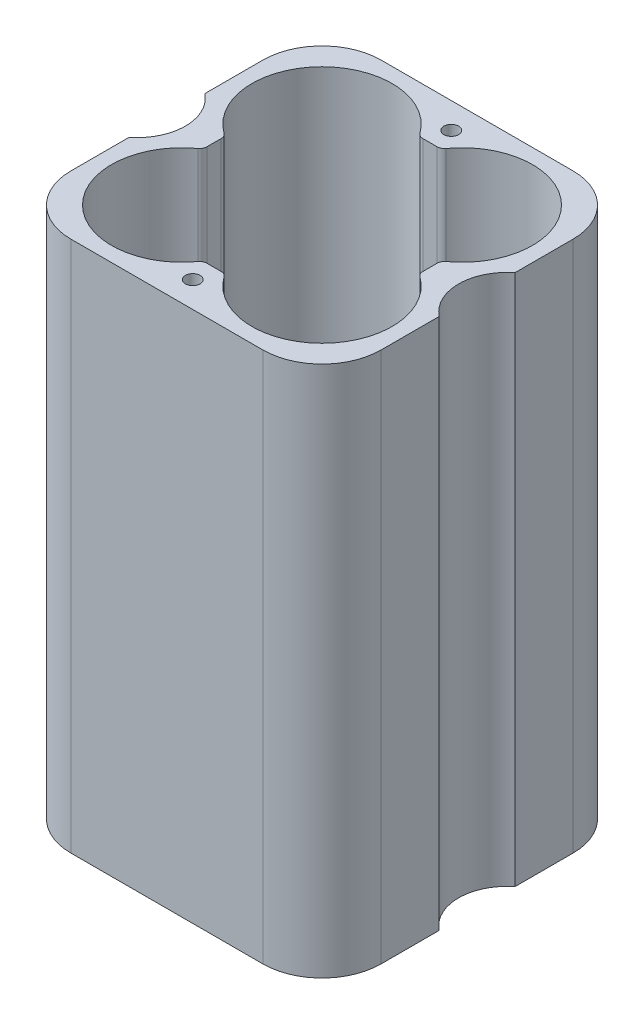
ISO-10303-21;
HEADER;
FILE_DESCRIPTION(('STEP AP214'),'2;1');
FILE_NAME('part.step','',(''),(''),'','','');
FILE_SCHEMA(('AUTOMOTIVE_DESIGN { 1 0 10303 214 1 1 1 1 }'));
ENDSEC;
DATA;
#1=APPLICATION_CONTEXT('core data for automotive mechanical design processes');
#2=APPLICATION_PROTOCOL_DEFINITION('international standard','automotive_design',2000,#1);
#3=PRODUCT_CONTEXT('',#1,'mechanical');
#4=PRODUCT('Part','Part','',(#3));
#5=PRODUCT_RELATED_PRODUCT_CATEGORY('part','',(#4));
#6=PRODUCT_DEFINITION_FORMATION('','',#4);
#7=PRODUCT_DEFINITION_CONTEXT('part definition',#1,'design');
#8=PRODUCT_DEFINITION('design','',#6,#7);
#9=PRODUCT_DEFINITION_SHAPE('','',#8);
#10=(LENGTH_UNIT() NAMED_UNIT(*) SI_UNIT(.MILLI.,.METRE.));
#11=(NAMED_UNIT(*) PLANE_ANGLE_UNIT() SI_UNIT($,.RADIAN.));
#12=(NAMED_UNIT(*) SI_UNIT($,.STERADIAN.) SOLID_ANGLE_UNIT());
#13=UNCERTAINTY_MEASURE_WITH_UNIT(LENGTH_MEASURE(1.E-05),#10,'distance_accuracy_value','');
#14=(GEOMETRIC_REPRESENTATION_CONTEXT(3) GLOBAL_UNCERTAINTY_ASSIGNED_CONTEXT((#13)) GLOBAL_UNIT_ASSIGNED_CONTEXT((#10,
#11,#12)) REPRESENTATION_CONTEXT('',''));
#15=CARTESIAN_POINT('',(0.,0.,0.));
#16=DIRECTION('',(0.,0.,1.));
#17=DIRECTION('',(1.,0.,0.));
#18=AXIS2_PLACEMENT_3D('',#15,#16,#17);
#19=CARTESIAN_POINT('',(21.,70.,0.));
#20=DIRECTION('',(-1.,0.,0.));
#21=DIRECTION('',(0.,0.,1.));
#22=AXIS2_PLACEMENT_3D('',#19,#20,#21);
#23=PLANE('',#22);
#24=DIRECTION('',(0.,-1.,0.));
#25=VECTOR('',#24,1.);
#26=CARTESIAN_POINT('',(21.,70.,12.9999999999999));
#27=LINE('',#26,#25);
#28=CARTESIAN_POINT('',(21.,70.,12.9999999999999));
#29=VERTEX_POINT('',#28);
#30=CARTESIAN_POINT('',(21.,-2.,12.9999999999999));
#31=VERTEX_POINT('',#30);
#32=EDGE_CURVE('E236',#29,#31,#27,.T.);
#33=ORIENTED_EDGE('',*,*,#32,.T.);
#34=DIRECTION('',(0.,0.,1.));
#35=VECTOR('',#34,1.);
#36=CARTESIAN_POINT('',(21.,-2.,5.12347538297982));
#37=LINE('',#36,#35);
#38=CARTESIAN_POINT('',(21.,-2.,5.12347538297982));
#39=VERTEX_POINT('',#38);
#40=EDGE_CURVE('E235',#39,#31,#37,.T.);
#41=ORIENTED_EDGE('',*,*,#40,.F.);
#42=DIRECTION('',(0.,-1.,0.));
#43=VECTOR('',#42,1.);
#44=CARTESIAN_POINT('',(21.,70.,5.12347538297982));
#45=LINE('',#44,#43);
#46=CARTESIAN_POINT('',(21.,70.,5.12347538297982));
#47=VERTEX_POINT('',#46);
#48=EDGE_CURVE('E221',#47,#39,#45,.T.);
#49=ORIENTED_EDGE('',*,*,#48,.F.);
#50=DIRECTION('',(0.,0.,-1.));
#51=VECTOR('',#50,1.);
#52=CARTESIAN_POINT('',(21.,70.,0.));
#53=LINE('',#52,#51);
#54=EDGE_CURVE('E306',#29,#47,#53,.T.);
#55=ORIENTED_EDGE('',*,*,#54,.F.);
#56=EDGE_LOOP('',(#33,#41,#49,#55));
#57=FACE_BOUND('',#56,.T.);
#58=ADVANCED_FACE('F36',(#57),#23,.F.);
#59=CARTESIAN_POINT('',(25.,70.,0.));
#60=DIRECTION('',(0.,-1.,0.));
#61=DIRECTION('',(0.,0.,-1.));
#62=AXIS2_PLACEMENT_3D('',#59,#60,#61);
#63=CYLINDRICAL_SURFACE('',#62,6.50000000000002);
#64=ORIENTED_EDGE('',*,*,#48,.T.);
#65=CARTESIAN_POINT('',(25.,-2.,0.));
#66=DIRECTION('',(0.,1.,0.));
#67=DIRECTION('',(0.,0.,-1.));
#68=AXIS2_PLACEMENT_3D('',#65,#66,#67);
#69=CIRCLE('',#68,6.50000000000002);
#70=CARTESIAN_POINT('',(21.,-2.,-5.12347538297982));
#71=VERTEX_POINT('',#70);
#72=EDGE_CURVE('E226',#71,#39,#69,.T.);
#73=ORIENTED_EDGE('',*,*,#72,.F.);
#74=DIRECTION('',(0.,-1.,0.));
#75=VECTOR('',#74,1.);
#76=CARTESIAN_POINT('',(21.,70.,-5.12347538297982));
#77=LINE('',#76,#75);
#78=CARTESIAN_POINT('',(21.,70.,-5.12347538297982));
#79=VERTEX_POINT('',#78);
#80=EDGE_CURVE('E232',#79,#71,#77,.T.);
#81=ORIENTED_EDGE('',*,*,#80,.F.);
#82=CARTESIAN_POINT('',(25.,70.,0.));
#83=DIRECTION('',(0.,1.,0.));
#84=DIRECTION('',(0.,0.,1.));
#85=AXIS2_PLACEMENT_3D('',#82,#83,#84);
#86=CIRCLE('',#85,6.50000000000002);
#87=EDGE_CURVE('E227',#47,#79,#86,.F.);
#88=ORIENTED_EDGE('',*,*,#87,.F.);
#89=EDGE_LOOP('',(#64,#73,#81,#88));
#90=FACE_BOUND('',#89,.T.);
#91=ADVANCED_FACE('F223',(#90),#63,.F.);
#92=ORIENTED_EDGE('',*,*,#80,.T.);
#93=DIRECTION('',(0.,0.,1.));
#94=VECTOR('',#93,1.);
#95=CARTESIAN_POINT('',(21.,-2.,-13.));
#96=LINE('',#95,#94);
#97=CARTESIAN_POINT('',(21.,-2.,-13.));
#98=VERTEX_POINT('',#97);
#99=EDGE_CURVE('E246',#98,#71,#96,.T.);
#100=ORIENTED_EDGE('',*,*,#99,.F.);
#101=DIRECTION('',(0.,-1.,0.));
#102=VECTOR('',#101,1.);
#103=CARTESIAN_POINT('',(21.,70.,-12.9999999999999));
#104=LINE('',#103,#102);
#105=CARTESIAN_POINT('',(21.,70.,-12.9999999999999));
#106=VERTEX_POINT('',#105);
#107=EDGE_CURVE('E371',#106,#98,#104,.T.);
#108=ORIENTED_EDGE('',*,*,#107,.F.);
#109=EDGE_CURVE('E308',#79,#106,#53,.T.);
#110=ORIENTED_EDGE('',*,*,#109,.F.);
#111=EDGE_LOOP('',(#92,#100,#108,#110));
#112=FACE_BOUND('',#111,.T.);
#113=ADVANCED_FACE('F516',(#112),#23,.F.);
#114=CARTESIAN_POINT('',(13.,70.,-13.));
#115=DIRECTION('',(0.,-1.,0.));
#116=DIRECTION('',(0.,0.,-1.));
#117=AXIS2_PLACEMENT_3D('',#114,#115,#116);
#118=CYLINDRICAL_SURFACE('',#117,8.);
#119=ORIENTED_EDGE('',*,*,#107,.T.);
#120=CARTESIAN_POINT('',(13.,-2.,-13.));
#121=DIRECTION('',(0.,-1.,0.));
#122=DIRECTION('',(0.,0.,-1.));
#123=AXIS2_PLACEMENT_3D('',#120,#121,#122);
#124=CIRCLE('',#123,8.);
#125=CARTESIAN_POINT('',(12.9999999999999,-2.,-21.));
#126=VERTEX_POINT('',#125);
#127=EDGE_CURVE('E278',#126,#98,#124,.T.);
#128=ORIENTED_EDGE('',*,*,#127,.F.);
#129=DIRECTION('',(0.,-1.,0.));
#130=VECTOR('',#129,1.);
#131=CARTESIAN_POINT('',(12.9999999999999,70.,-21.));
#132=LINE('',#131,#130);
#133=CARTESIAN_POINT('',(12.9999999999999,70.,-21.));
#134=VERTEX_POINT('',#133);
#135=EDGE_CURVE('E369',#134,#126,#132,.T.);
#136=ORIENTED_EDGE('',*,*,#135,.F.);
#137=CARTESIAN_POINT('',(13.,70.,-13.));
#138=DIRECTION('',(0.,1.,0.));
#139=DIRECTION('',(0.,0.,1.));
#140=AXIS2_PLACEMENT_3D('',#137,#138,#139);
#141=CIRCLE('',#140,8.);
#142=EDGE_CURVE('E310',#106,#134,#141,.T.);
#143=ORIENTED_EDGE('',*,*,#142,.F.);
#144=EDGE_LOOP('',(#119,#128,#136,#143));
#145=FACE_BOUND('',#144,.T.);
#146=ADVANCED_FACE('F523',(#145),#118,.T.);
#147=CARTESIAN_POINT('',(0.,70.,-21.));
#148=DIRECTION('',(0.,0.,-1.));
#149=DIRECTION('',(-1.,0.,0.));
#150=AXIS2_PLACEMENT_3D('',#147,#148,#149);
#151=PLANE('',#150);
#152=ORIENTED_EDGE('',*,*,#135,.T.);
#153=DIRECTION('',(1.,0.,0.));
#154=VECTOR('',#153,1.);
#155=CARTESIAN_POINT('',(-12.9999999999999,-2.,-21.));
#156=LINE('',#155,#154);
#157=CARTESIAN_POINT('',(-13.,-2.,-21.));
#158=VERTEX_POINT('',#157);
#159=EDGE_CURVE('E275',#158,#126,#156,.T.);
#160=ORIENTED_EDGE('',*,*,#159,.F.);
#161=DIRECTION('',(0.,-1.,0.));
#162=VECTOR('',#161,1.);
#163=CARTESIAN_POINT('',(-12.9999999999999,70.,-21.));
#164=LINE('',#163,#162);
#165=CARTESIAN_POINT('',(-12.9999999999999,70.,-21.));
#166=VERTEX_POINT('',#165);
#167=EDGE_CURVE('E367',#166,#158,#164,.T.);
#168=ORIENTED_EDGE('',*,*,#167,.F.);
#169=DIRECTION('',(1.,0.,0.));
#170=VECTOR('',#169,1.);
#171=CARTESIAN_POINT('',(0.,70.,-21.));
#172=LINE('',#171,#170);
#173=EDGE_CURVE('E312',#166,#134,#172,.T.);
#174=ORIENTED_EDGE('',*,*,#173,.T.);
#175=EDGE_LOOP('',(#152,#160,#168,#174));
#176=FACE_BOUND('',#175,.T.);
#177=ADVANCED_FACE('F528',(#176),#151,.T.);
#178=CARTESIAN_POINT('',(-13.,70.,-13.));
#179=DIRECTION('',(0.,-1.,0.));
#180=DIRECTION('',(0.,0.,-1.));
#181=AXIS2_PLACEMENT_3D('',#178,#179,#180);
#182=CYLINDRICAL_SURFACE('',#181,8.);
#183=ORIENTED_EDGE('',*,*,#167,.T.);
#184=CARTESIAN_POINT('',(-13.,-2.,-13.));
#185=DIRECTION('',(0.,-1.,0.));
#186=DIRECTION('',(0.,0.,-1.));
#187=AXIS2_PLACEMENT_3D('',#184,#185,#186);
#188=CIRCLE('',#187,8.);
#189=CARTESIAN_POINT('',(-21.,-2.,-12.9999999999999));
#190=VERTEX_POINT('',#189);
#191=EDGE_CURVE('E272',#190,#158,#188,.T.);
#192=ORIENTED_EDGE('',*,*,#191,.F.);
#193=DIRECTION('',(0.,-1.,0.));
#194=VECTOR('',#193,1.);
#195=CARTESIAN_POINT('',(-21.,70.,-12.9999999999999));
#196=LINE('',#195,#194);
#197=CARTESIAN_POINT('',(-21.,70.,-12.9999999999999));
#198=VERTEX_POINT('',#197);
#199=EDGE_CURVE('E365',#198,#190,#196,.T.);
#200=ORIENTED_EDGE('',*,*,#199,.F.);
#201=CARTESIAN_POINT('',(-13.,70.,-13.));
#202=DIRECTION('',(0.,1.,0.));
#203=DIRECTION('',(0.,0.,1.));
#204=AXIS2_PLACEMENT_3D('',#201,#202,#203);
#205=CIRCLE('',#204,8.);
#206=EDGE_CURVE('E315',#198,#166,#205,.F.);
#207=ORIENTED_EDGE('',*,*,#206,.T.);
#208=EDGE_LOOP('',(#183,#192,#200,#207));
#209=FACE_BOUND('',#208,.T.);
#210=ADVANCED_FACE('F565',(#209),#182,.T.);
#211=CARTESIAN_POINT('',(-21.,70.,0.));
#212=DIRECTION('',(-1.,0.,0.));
#213=DIRECTION('',(0.,0.,1.));
#214=AXIS2_PLACEMENT_3D('',#211,#212,#213);
#215=PLANE('',#214);
#216=ORIENTED_EDGE('',*,*,#199,.T.);
#217=DIRECTION('',(0.,0.,-1.));
#218=VECTOR('',#217,1.);
#219=CARTESIAN_POINT('',(-21.,-2.,-5.12347538297981));
#220=LINE('',#219,#218);
#221=CARTESIAN_POINT('',(-21.,-2.,-5.12347538297981));
#222=VERTEX_POINT('',#221);
#223=EDGE_CURVE('E269',#222,#190,#220,.T.);
#224=ORIENTED_EDGE('',*,*,#223,.F.);
#225=DIRECTION('',(0.,-1.,0.));
#226=VECTOR('',#225,1.);
#227=CARTESIAN_POINT('',(-21.,70.,-5.12347538297981));
#228=LINE('',#227,#226);
#229=CARTESIAN_POINT('',(-21.,70.,-5.12347538297981));
#230=VERTEX_POINT('',#229);
#231=EDGE_CURVE('E363',#230,#222,#228,.T.);
#232=ORIENTED_EDGE('',*,*,#231,.F.);
#233=DIRECTION('',(0.,0.,-1.));
#234=VECTOR('',#233,1.);
#235=CARTESIAN_POINT('',(-21.,70.,0.));
#236=LINE('',#235,#234);
#237=EDGE_CURVE('E318',#230,#198,#236,.T.);
#238=ORIENTED_EDGE('',*,*,#237,.T.);
#239=EDGE_LOOP('',(#216,#224,#232,#238));
#240=FACE_BOUND('',#239,.T.);
#241=ADVANCED_FACE('F560',(#240),#215,.T.);
#242=CARTESIAN_POINT('',(-25.,70.,0.));
#243=DIRECTION('',(0.,-1.,0.));
#244=DIRECTION('',(0.,0.,-1.));
#245=AXIS2_PLACEMENT_3D('',#242,#243,#244);
#246=CYLINDRICAL_SURFACE('',#245,6.50000000000001);
#247=ORIENTED_EDGE('',*,*,#231,.T.);
#248=CARTESIAN_POINT('',(-25.,-2.,0.));
#249=DIRECTION('',(0.,1.,0.));
#250=DIRECTION('',(0.,0.,-1.));
#251=AXIS2_PLACEMENT_3D('',#248,#249,#250);
#252=CIRCLE('',#251,6.5);
#253=CARTESIAN_POINT('',(-21.,-2.,5.12347538297981));
#254=VERTEX_POINT('',#253);
#255=EDGE_CURVE('E266',#254,#222,#252,.T.);
#256=ORIENTED_EDGE('',*,*,#255,.F.);
#257=DIRECTION('',(0.,-1.,0.));
#258=VECTOR('',#257,1.);
#259=CARTESIAN_POINT('',(-21.,70.,5.12347538297981));
#260=LINE('',#259,#258);
#261=CARTESIAN_POINT('',(-21.,70.,5.12347538297981));
#262=VERTEX_POINT('',#261);
#263=EDGE_CURVE('E361',#262,#254,#260,.T.);
#264=ORIENTED_EDGE('',*,*,#263,.F.);
#265=CARTESIAN_POINT('',(-25.,70.,0.));
#266=DIRECTION('',(0.,1.,0.));
#267=DIRECTION('',(0.,0.,1.));
#268=AXIS2_PLACEMENT_3D('',#265,#266,#267);
#269=CIRCLE('',#268,6.50000000000001);
#270=EDGE_CURVE('E321',#262,#230,#269,.T.);
#271=ORIENTED_EDGE('',*,*,#270,.T.);
#272=EDGE_LOOP('',(#247,#256,#264,#271));
#273=FACE_BOUND('',#272,.T.);
#274=ADVANCED_FACE('F556',(#273),#246,.F.);
#275=ORIENTED_EDGE('',*,*,#263,.T.);
#276=DIRECTION('',(0.,0.,-1.));
#277=VECTOR('',#276,1.);
#278=CARTESIAN_POINT('',(-21.,-2.,12.9999999999999));
#279=LINE('',#278,#277);
#280=CARTESIAN_POINT('',(-21.,-2.,12.9999999999999));
#281=VERTEX_POINT('',#280);
#282=EDGE_CURVE('E263',#281,#254,#279,.T.);
#283=ORIENTED_EDGE('',*,*,#282,.F.);
#284=DIRECTION('',(0.,-1.,0.));
#285=VECTOR('',#284,1.);
#286=CARTESIAN_POINT('',(-21.,70.,12.9999999999999));
#287=LINE('',#286,#285);
#288=CARTESIAN_POINT('',(-21.,70.,12.9999999999999));
#289=VERTEX_POINT('',#288);
#290=EDGE_CURVE('E359',#289,#281,#287,.T.);
#291=ORIENTED_EDGE('',*,*,#290,.F.);
#292=EDGE_CURVE('E322',#289,#262,#236,.T.);
#293=ORIENTED_EDGE('',*,*,#292,.T.);
#294=EDGE_LOOP('',(#275,#283,#291,#293));
#295=FACE_BOUND('',#294,.T.);
#296=ADVANCED_FACE('F552',(#295),#215,.T.);
#297=CARTESIAN_POINT('',(-13.,70.,13.));
#298=DIRECTION('',(0.,-1.,0.));
#299=DIRECTION('',(0.,0.,-1.));
#300=AXIS2_PLACEMENT_3D('',#297,#298,#299);
#301=CYLINDRICAL_SURFACE('',#300,8.);
#302=ORIENTED_EDGE('',*,*,#290,.T.);
#303=CARTESIAN_POINT('',(-13.,-2.,13.));
#304=DIRECTION('',(0.,-1.,0.));
#305=DIRECTION('',(0.,0.,-1.));
#306=AXIS2_PLACEMENT_3D('',#303,#304,#305);
#307=CIRCLE('',#306,8.);
#308=CARTESIAN_POINT('',(-12.9999999999999,-2.,21.));
#309=VERTEX_POINT('',#308);
#310=EDGE_CURVE('E260',#309,#281,#307,.T.);
#311=ORIENTED_EDGE('',*,*,#310,.F.);
#312=DIRECTION('',(0.,-1.,0.));
#313=VECTOR('',#312,1.);
#314=CARTESIAN_POINT('',(-12.9999999999999,70.,21.));
#315=LINE('',#314,#313);
#316=CARTESIAN_POINT('',(-12.9999999999999,70.,21.));
#317=VERTEX_POINT('',#316);
#318=EDGE_CURVE('E357',#317,#309,#315,.T.);
#319=ORIENTED_EDGE('',*,*,#318,.F.);
#320=CARTESIAN_POINT('',(-13.,70.,13.));
#321=DIRECTION('',(0.,1.,0.));
#322=DIRECTION('',(0.,0.,1.));
#323=AXIS2_PLACEMENT_3D('',#320,#321,#322);
#324=CIRCLE('',#323,8.);
#325=EDGE_CURVE('E325',#289,#317,#324,.T.);
#326=ORIENTED_EDGE('',*,*,#325,.F.);
#327=EDGE_LOOP('',(#302,#311,#319,#326));
#328=FACE_BOUND('',#327,.T.);
#329=ADVANCED_FACE('F547',(#328),#301,.T.);
#330=CARTESIAN_POINT('',(0.,70.,21.));
#331=DIRECTION('',(0.,0.,-1.));
#332=DIRECTION('',(-1.,0.,0.));
#333=AXIS2_PLACEMENT_3D('',#330,#331,#332);
#334=PLANE('',#333);
#335=ORIENTED_EDGE('',*,*,#318,.T.);
#336=DIRECTION('',(-1.,0.,0.));
#337=VECTOR('',#336,1.);
#338=CARTESIAN_POINT('',(12.9999999999999,-2.,21.));
#339=LINE('',#338,#337);
#340=CARTESIAN_POINT('',(12.9999999999999,-2.,21.));
#341=VERTEX_POINT('',#340);
#342=EDGE_CURVE('E257',#341,#309,#339,.T.);
#343=ORIENTED_EDGE('',*,*,#342,.F.);
#344=DIRECTION('',(0.,-1.,0.));
#345=VECTOR('',#344,1.);
#346=CARTESIAN_POINT('',(12.9999999999999,70.,21.));
#347=LINE('',#346,#345);
#348=CARTESIAN_POINT('',(12.9999999999999,70.,21.));
#349=VERTEX_POINT('',#348);
#350=EDGE_CURVE('E355',#349,#341,#347,.T.);
#351=ORIENTED_EDGE('',*,*,#350,.F.);
#352=DIRECTION('',(1.,0.,0.));
#353=VECTOR('',#352,1.);
#354=CARTESIAN_POINT('',(0.,70.,21.));
#355=LINE('',#354,#353);
#356=EDGE_CURVE('E327',#317,#349,#355,.T.);
#357=ORIENTED_EDGE('',*,*,#356,.F.);
#358=EDGE_LOOP('',(#335,#343,#351,#357));
#359=FACE_BOUND('',#358,.T.);
#360=ADVANCED_FACE('F543',(#359),#334,.F.);
#361=CARTESIAN_POINT('',(9.5,70.,9.5));
#362=DIRECTION('',(0.,-1.,0.));
#363=DIRECTION('',(0.,0.,-1.));
#364=AXIS2_PLACEMENT_3D('',#361,#362,#363);
#365=CYLINDRICAL_SURFACE('',#364,9.5);
#366=CARTESIAN_POINT('',(9.5,70.,9.5));
#367=DIRECTION('',(0.,1.,0.));
#368=DIRECTION('',(0.,0.,1.));
#369=AXIS2_PLACEMENT_3D('',#366,#367,#368);
#370=CIRCLE('',#369,9.5);
#371=CARTESIAN_POINT('',(1.78279732199267,70.,15.0402872512674));
#372=VERTEX_POINT('',#371);
#373=CARTESIAN_POINT('',(15.0402872512674,70.,1.78279732199267));
#374=VERTEX_POINT('',#373);
#375=EDGE_CURVE('E282',#372,#374,#370,.T.);
#376=ORIENTED_EDGE('',*,*,#375,.T.);
#377=DIRECTION('',(0.,-1.,0.));
#378=VECTOR('',#377,1.);
#379=CARTESIAN_POINT('',(15.0402872512674,70.,1.78279732199267));
#380=LINE('',#379,#378);
#381=CARTESIAN_POINT('',(15.0402872512674,0.,1.78279732199267));
#382=VERTEX_POINT('',#381);
#383=EDGE_CURVE('E375',#374,#382,#380,.T.);
#384=ORIENTED_EDGE('',*,*,#383,.T.);
#385=CARTESIAN_POINT('',(9.5,0.,9.5));
#386=DIRECTION('',(0.,1.,0.));
#387=DIRECTION('',(0.,0.,1.));
#388=AXIS2_PLACEMENT_3D('',#385,#386,#387);
#389=CIRCLE('',#388,9.5);
#390=CARTESIAN_POINT('',(1.78279732199267,0.,15.0402872512674));
#391=VERTEX_POINT('',#390);
#392=EDGE_CURVE('E281',#391,#382,#389,.T.);
#393=ORIENTED_EDGE('',*,*,#392,.F.);
#394=DIRECTION('',(0.,-1.,0.));
#395=VECTOR('',#394,1.);
#396=CARTESIAN_POINT('',(1.78279732199267,70.,15.0402872512674));
#397=LINE('',#396,#395);
#398=EDGE_CURVE('E231',#391,#372,#397,.F.);
#399=ORIENTED_EDGE('',*,*,#398,.T.);
#400=EDGE_LOOP('',(#376,#384,#393,#399));
#401=FACE_BOUND('',#400,.T.);
#402=ADVANCED_FACE('F474',(#401),#365,.F.);
#403=CARTESIAN_POINT('',(0.,70.,14.6234753829798));
#404=DIRECTION('',(0.,0.,-1.));
#405=DIRECTION('',(-1.,0.,0.));
#406=AXIS2_PLACEMENT_3D('',#403,#404,#405);
#407=PLANE('',#406);
#408=DIRECTION('',(1.,0.,0.));
#409=VECTOR('',#408,1.);
#410=CARTESIAN_POINT('',(0.,70.,14.6234753829798));
#411=LINE('',#410,#409);
#412=CARTESIAN_POINT('',(-0.970460197991891,70.,14.6234753829798));
#413=VERTEX_POINT('',#412);
#414=CARTESIAN_POINT('',(0.970460197991897,70.,14.6234753829798));
#415=VERTEX_POINT('',#414);
#416=EDGE_CURVE('E285',#413,#415,#411,.T.);
#417=ORIENTED_EDGE('',*,*,#416,.T.);
#418=DIRECTION('',(0.,-1.,0.));
#419=VECTOR('',#418,1.);
#420=CARTESIAN_POINT('',(0.970460197991897,70.,14.6234753829798));
#421=LINE('',#420,#419);
#422=CARTESIAN_POINT('',(0.970460197991897,0.,14.6234753829798));
#423=VERTEX_POINT('',#422);
#424=EDGE_CURVE('E428',#415,#423,#421,.T.);
#425=ORIENTED_EDGE('',*,*,#424,.T.);
#426=DIRECTION('',(1.,0.,0.));
#427=VECTOR('',#426,1.);
#428=CARTESIAN_POINT('',(0.,0.,14.6234753829798));
#429=LINE('',#428,#427);
#430=CARTESIAN_POINT('',(-0.970460197991891,0.,14.6234753829798));
#431=VERTEX_POINT('',#430);
#432=EDGE_CURVE('E334',#431,#423,#429,.T.);
#433=ORIENTED_EDGE('',*,*,#432,.F.);
#434=DIRECTION('',(0.,-1.,0.));
#435=VECTOR('',#434,1.);
#436=CARTESIAN_POINT('',(-0.970460197991891,70.,14.6234753829798));
#437=LINE('',#436,#435);
#438=EDGE_CURVE('E426',#431,#413,#437,.F.);
#439=ORIENTED_EDGE('',*,*,#438,.T.);
#440=EDGE_LOOP('',(#417,#425,#433,#439));
#441=FACE_BOUND('',#440,.T.);
#442=ADVANCED_FACE('F482',(#441),#407,.T.);
#443=CARTESIAN_POINT('',(-9.5,70.,9.5));
#444=DIRECTION('',(0.,-1.,0.));
#445=DIRECTION('',(0.,0.,-1.));
#446=AXIS2_PLACEMENT_3D('',#443,#444,#445);
#447=CYLINDRICAL_SURFACE('',#446,9.5);
#448=CARTESIAN_POINT('',(-9.5,70.,9.5));
#449=DIRECTION('',(0.,1.,0.));
#450=DIRECTION('',(0.,0.,1.));
#451=AXIS2_PLACEMENT_3D('',#448,#449,#450);
#452=CIRCLE('',#451,9.5);
#453=CARTESIAN_POINT('',(-15.0402872512674,70.,1.78279732199267));
#454=VERTEX_POINT('',#453);
#455=CARTESIAN_POINT('',(-1.78279732199266,70.,15.0402872512674));
#456=VERTEX_POINT('',#455);
#457=EDGE_CURVE('E289',#454,#456,#452,.T.);
#458=ORIENTED_EDGE('',*,*,#457,.T.);
#459=DIRECTION('',(0.,-1.,0.));
#460=VECTOR('',#459,1.);
#461=CARTESIAN_POINT('',(-1.78279732199266,70.,15.0402872512674));
#462=LINE('',#461,#460);
#463=CARTESIAN_POINT('',(-1.78279732199266,0.,15.0402872512674));
#464=VERTEX_POINT('',#463);
#465=EDGE_CURVE('E433',#456,#464,#462,.T.);
#466=ORIENTED_EDGE('',*,*,#465,.T.);
#467=CARTESIAN_POINT('',(-9.5,0.,9.5));
#468=DIRECTION('',(0.,1.,0.));
#469=DIRECTION('',(0.,0.,1.));
#470=AXIS2_PLACEMENT_3D('',#467,#468,#469);
#471=CIRCLE('',#470,9.5);
#472=CARTESIAN_POINT('',(-15.0402872512674,0.,1.78279732199267));
#473=VERTEX_POINT('',#472);
#474=EDGE_CURVE('E337',#473,#464,#471,.T.);
#475=ORIENTED_EDGE('',*,*,#474,.F.);
#476=DIRECTION('',(0.,-1.,0.));
#477=VECTOR('',#476,1.);
#478=CARTESIAN_POINT('',(-15.0402872512674,70.,1.78279732199267));
#479=LINE('',#478,#477);
#480=EDGE_CURVE('E431',#473,#454,#479,.F.);
#481=ORIENTED_EDGE('',*,*,#480,.T.);
#482=EDGE_LOOP('',(#458,#466,#475,#481));
#483=FACE_BOUND('',#482,.T.);
#484=ADVANCED_FACE('F489',(#483),#447,.F.);
#485=CARTESIAN_POINT('',(-14.6234753829798,70.,0.));
#486=DIRECTION('',(1.,0.,0.));
#487=DIRECTION('',(0.,0.,-1.));
#488=AXIS2_PLACEMENT_3D('',#485,#486,#487);
#489=PLANE('',#488);
#490=DIRECTION('',(0.,0.,1.));
#491=VECTOR('',#490,1.);
#492=CARTESIAN_POINT('',(-14.6234753829798,70.,0.));
#493=LINE('',#492,#491);
#494=CARTESIAN_POINT('',(-14.6234753829798,70.,-0.970460197991893));
#495=VERTEX_POINT('',#494);
#496=CARTESIAN_POINT('',(-14.6234753829798,70.,0.970460197991897));
#497=VERTEX_POINT('',#496);
#498=EDGE_CURVE('E292',#495,#497,#493,.T.);
#499=ORIENTED_EDGE('',*,*,#498,.T.);
#500=DIRECTION('',(0.,-1.,0.));
#501=VECTOR('',#500,1.);
#502=CARTESIAN_POINT('',(-14.6234753829798,70.,0.970460197991897));
#503=LINE('',#502,#501);
#504=CARTESIAN_POINT('',(-14.6234753829798,0.,0.970460197991897));
#505=VERTEX_POINT('',#504);
#506=EDGE_CURVE('E438',#497,#505,#503,.T.);
#507=ORIENTED_EDGE('',*,*,#506,.T.);
#508=DIRECTION('',(0.,0.,1.));
#509=VECTOR('',#508,1.);
#510=CARTESIAN_POINT('',(-14.6234753829798,0.,0.));
#511=LINE('',#510,#509);
#512=CARTESIAN_POINT('',(-14.6234753829798,0.,-0.970460197991893));
#513=VERTEX_POINT('',#512);
#514=EDGE_CURVE('E340',#513,#505,#511,.T.);
#515=ORIENTED_EDGE('',*,*,#514,.F.);
#516=DIRECTION('',(0.,-1.,0.));
#517=VECTOR('',#516,1.);
#518=CARTESIAN_POINT('',(-14.6234753829798,70.,-0.970460197991893));
#519=LINE('',#518,#517);
#520=EDGE_CURVE('E436',#513,#495,#519,.F.);
#521=ORIENTED_EDGE('',*,*,#520,.T.);
#522=EDGE_LOOP('',(#499,#507,#515,#521));
#523=FACE_BOUND('',#522,.T.);
#524=ADVANCED_FACE('F498',(#523),#489,.T.);
#525=CARTESIAN_POINT('',(-9.5,70.,-9.5));
#526=DIRECTION('',(0.,-1.,0.));
#527=DIRECTION('',(0.,0.,-1.));
#528=AXIS2_PLACEMENT_3D('',#525,#526,#527);
#529=CYLINDRICAL_SURFACE('',#528,9.5);
#530=CARTESIAN_POINT('',(-9.5,70.,-9.5));
#531=DIRECTION('',(0.,1.,0.));
#532=DIRECTION('',(0.,0.,1.));
#533=AXIS2_PLACEMENT_3D('',#530,#531,#532);
#534=CIRCLE('',#533,9.5);
#535=CARTESIAN_POINT('',(-1.78279732199267,70.,-15.0402872512674));
#536=VERTEX_POINT('',#535);
#537=CARTESIAN_POINT('',(-15.0402872512674,70.,-1.78279732199267));
#538=VERTEX_POINT('',#537);
#539=EDGE_CURVE('E295',#536,#538,#534,.T.);
#540=ORIENTED_EDGE('',*,*,#539,.T.);
#541=DIRECTION('',(0.,-1.,0.));
#542=VECTOR('',#541,1.);
#543=CARTESIAN_POINT('',(-15.0402872512674,70.,-1.78279732199267));
#544=LINE('',#543,#542);
#545=CARTESIAN_POINT('',(-15.0402872512674,0.,-1.78279732199267));
#546=VERTEX_POINT('',#545);
#547=EDGE_CURVE('E443',#538,#546,#544,.T.);
#548=ORIENTED_EDGE('',*,*,#547,.T.);
#549=CARTESIAN_POINT('',(-9.5,0.,-9.5));
#550=DIRECTION('',(0.,1.,0.));
#551=DIRECTION('',(0.,0.,1.));
#552=AXIS2_PLACEMENT_3D('',#549,#550,#551);
#553=CIRCLE('',#552,9.5);
#554=CARTESIAN_POINT('',(-1.78279732199267,0.,-15.0402872512674));
#555=VERTEX_POINT('',#554);
#556=EDGE_CURVE('E343',#555,#546,#553,.T.);
#557=ORIENTED_EDGE('',*,*,#556,.F.);
#558=DIRECTION('',(0.,-1.,0.));
#559=VECTOR('',#558,1.);
#560=CARTESIAN_POINT('',(-1.78279732199267,70.,-15.0402872512674));
#561=LINE('',#560,#559);
#562=EDGE_CURVE('E441',#555,#536,#561,.F.);
#563=ORIENTED_EDGE('',*,*,#562,.T.);
#564=EDGE_LOOP('',(#540,#548,#557,#563));
#565=FACE_BOUND('',#564,.T.);
#566=ADVANCED_FACE('F505',(#565),#529,.F.);
#567=CARTESIAN_POINT('',(0.,70.,-14.6234753829798));
#568=DIRECTION('',(0.,0.,1.));
#569=DIRECTION('',(1.,0.,0.));
#570=AXIS2_PLACEMENT_3D('',#567,#568,#569);
#571=PLANE('',#570);
#572=DIRECTION('',(-1.,0.,0.));
#573=VECTOR('',#572,1.);
#574=CARTESIAN_POINT('',(0.,0.,-14.6234753829798));
#575=LINE('',#574,#573);
#576=CARTESIAN_POINT('',(0.970460197991895,0.,-14.6234753829798));
#577=VERTEX_POINT('',#576);
#578=CARTESIAN_POINT('',(-0.970460197991897,0.,-14.6234753829798));
#579=VERTEX_POINT('',#578);
#580=EDGE_CURVE('E346',#577,#579,#575,.T.);
#581=ORIENTED_EDGE('',*,*,#580,.F.);
#582=DIRECTION('',(0.,-1.,0.));
#583=VECTOR('',#582,1.);
#584=CARTESIAN_POINT('',(0.970460197991895,70.,-14.6234753829798));
#585=LINE('',#584,#583);
#586=CARTESIAN_POINT('',(0.970460197991895,70.,-14.6234753829798));
#587=VERTEX_POINT('',#586);
#588=EDGE_CURVE('E11',#577,#587,#585,.F.);
#589=ORIENTED_EDGE('',*,*,#588,.T.);
#590=DIRECTION('',(-1.,0.,0.));
#591=VECTOR('',#590,1.);
#592=CARTESIAN_POINT('',(0.,70.,-14.6234753829798));
#593=LINE('',#592,#591);
#594=CARTESIAN_POINT('',(-0.970460197991897,70.,-14.6234753829798));
#595=VERTEX_POINT('',#594);
#596=EDGE_CURVE('E298',#587,#595,#593,.T.);
#597=ORIENTED_EDGE('',*,*,#596,.T.);
#598=DIRECTION('',(0.,-1.,0.));
#599=VECTOR('',#598,1.);
#600=CARTESIAN_POINT('',(-0.970460197991897,70.,-14.6234753829798));
#601=LINE('',#600,#599);
#602=EDGE_CURVE('E44',#595,#579,#601,.T.);
#603=ORIENTED_EDGE('',*,*,#602,.T.);
#604=EDGE_LOOP('',(#581,#589,#597,#603));
#605=FACE_BOUND('',#604,.T.);
#606=ADVANCED_FACE('F448',(#605),#571,.T.);
#607=CARTESIAN_POINT('',(9.5,70.,-9.5));
#608=DIRECTION('',(0.,-1.,0.));
#609=DIRECTION('',(0.,0.,-1.));
#610=AXIS2_PLACEMENT_3D('',#607,#608,#609);
#611=CYLINDRICAL_SURFACE('',#610,9.5);
#612=CARTESIAN_POINT('',(9.5,0.,-9.5));
#613=DIRECTION('',(0.,1.,0.));
#614=DIRECTION('',(0.,0.,1.));
#615=AXIS2_PLACEMENT_3D('',#612,#613,#614);
#616=CIRCLE('',#615,9.5);
#617=CARTESIAN_POINT('',(15.0402872512674,0.,-1.78279732199266));
#618=VERTEX_POINT('',#617);
#619=CARTESIAN_POINT('',(1.78279732199267,0.,-15.0402872512674));
#620=VERTEX_POINT('',#619);
#621=EDGE_CURVE('E349',#618,#620,#616,.T.);
#622=ORIENTED_EDGE('',*,*,#621,.F.);
#623=DIRECTION('',(0.,-1.,0.));
#624=VECTOR('',#623,1.);
#625=CARTESIAN_POINT('',(15.0402872512674,70.,-1.78279732199266));
#626=LINE('',#625,#624);
#627=CARTESIAN_POINT('',(15.0402872512674,70.,-1.78279732199266));
#628=VERTEX_POINT('',#627);
#629=EDGE_CURVE('E58',#618,#628,#626,.F.);
#630=ORIENTED_EDGE('',*,*,#629,.T.);
#631=CARTESIAN_POINT('',(9.5,70.,-9.5));
#632=DIRECTION('',(0.,1.,0.));
#633=DIRECTION('',(0.,0.,1.));
#634=AXIS2_PLACEMENT_3D('',#631,#632,#633);
#635=CIRCLE('',#634,9.5);
#636=CARTESIAN_POINT('',(1.78279732199267,70.,-15.0402872512674));
#637=VERTEX_POINT('',#636);
#638=EDGE_CURVE('E301',#628,#637,#635,.T.);
#639=ORIENTED_EDGE('',*,*,#638,.T.);
#640=DIRECTION('',(0.,-1.,0.));
#641=VECTOR('',#640,1.);
#642=CARTESIAN_POINT('',(1.78279732199267,70.,-15.0402872512674));
#643=LINE('',#642,#641);
#644=EDGE_CURVE('E422',#637,#620,#643,.T.);
#645=ORIENTED_EDGE('',*,*,#644,.T.);
#646=EDGE_LOOP('',(#622,#630,#639,#645));
#647=FACE_BOUND('',#646,.T.);
#648=ADVANCED_FACE('F457',(#647),#611,.F.);
#649=CARTESIAN_POINT('',(14.6234753829798,70.,0.));
#650=DIRECTION('',(-1.,0.,0.));
#651=DIRECTION('',(0.,0.,1.));
#652=AXIS2_PLACEMENT_3D('',#649,#650,#651);
#653=PLANE('',#652);
#654=DIRECTION('',(0.,0.,-1.));
#655=VECTOR('',#654,1.);
#656=CARTESIAN_POINT('',(14.6234753829798,0.,0.));
#657=LINE('',#656,#655);
#658=CARTESIAN_POINT('',(14.6234753829798,0.,0.970460197991895));
#659=VERTEX_POINT('',#658);
#660=CARTESIAN_POINT('',(14.6234753829798,0.,-0.970460197991891));
#661=VERTEX_POINT('',#660);
#662=EDGE_CURVE('E286',#659,#661,#657,.T.);
#663=ORIENTED_EDGE('',*,*,#662,.F.);
#664=DIRECTION('',(0.,-1.,0.));
#665=VECTOR('',#664,1.);
#666=CARTESIAN_POINT('',(14.6234753829798,70.,0.970460197991895));
#667=LINE('',#666,#665);
#668=CARTESIAN_POINT('',(14.6234753829798,70.,0.970460197991895));
#669=VERTEX_POINT('',#668);
#670=EDGE_CURVE('E405',#659,#669,#667,.F.);
#671=ORIENTED_EDGE('',*,*,#670,.T.);
#672=DIRECTION('',(0.,0.,-1.));
#673=VECTOR('',#672,1.);
#674=CARTESIAN_POINT('',(14.6234753829798,70.,0.));
#675=LINE('',#674,#673);
#676=CARTESIAN_POINT('',(14.6234753829798,70.,-0.970460197991891));
#677=VERTEX_POINT('',#676);
#678=EDGE_CURVE('E303',#669,#677,#675,.T.);
#679=ORIENTED_EDGE('',*,*,#678,.T.);
#680=DIRECTION('',(0.,-1.,0.));
#681=VECTOR('',#680,1.);
#682=CARTESIAN_POINT('',(14.6234753829798,70.,-0.970460197991891));
#683=LINE('',#682,#681);
#684=EDGE_CURVE('E402',#677,#661,#683,.T.);
#685=ORIENTED_EDGE('',*,*,#684,.T.);
#686=EDGE_LOOP('',(#663,#671,#679,#685));
#687=FACE_BOUND('',#686,.T.);
#688=ADVANCED_FACE('F466',(#687),#653,.T.);
#689=CARTESIAN_POINT('',(13.,70.,13.));
#690=DIRECTION('',(0.,-1.,0.));
#691=DIRECTION('',(0.,0.,-1.));
#692=AXIS2_PLACEMENT_3D('',#689,#690,#691);
#693=CYLINDRICAL_SURFACE('',#692,8.);
#694=ORIENTED_EDGE('',*,*,#350,.T.);
#695=CARTESIAN_POINT('',(13.,-2.,13.));
#696=DIRECTION('',(0.,-1.,0.));
#697=DIRECTION('',(0.,0.,-1.));
#698=AXIS2_PLACEMENT_3D('',#695,#696,#697);
#699=CIRCLE('',#698,8.);
#700=EDGE_CURVE('E240',#31,#341,#699,.T.);
#701=ORIENTED_EDGE('',*,*,#700,.F.);
#702=ORIENTED_EDGE('',*,*,#32,.F.);
#703=CARTESIAN_POINT('',(13.,70.,13.));
#704=DIRECTION('',(0.,1.,0.));
#705=DIRECTION('',(0.,0.,1.));
#706=AXIS2_PLACEMENT_3D('',#703,#704,#705);
#707=CIRCLE('',#706,8.);
#708=EDGE_CURVE('E329',#29,#349,#707,.F.);
#709=ORIENTED_EDGE('',*,*,#708,.T.);
#710=EDGE_LOOP('',(#694,#701,#702,#709));
#711=FACE_BOUND('',#710,.T.);
#712=ADVANCED_FACE('F539',(#711),#693,.T.);
#713=CARTESIAN_POINT('',(0.,70.,0.));
#714=DIRECTION('',(0.,1.,0.));
#715=DIRECTION('',(0.,0.,1.));
#716=AXIS2_PLACEMENT_3D('',#713,#714,#715);
#717=PLANE('',#716);
#718=CARTESIAN_POINT('',(0.,70.,-17.5));
#719=DIRECTION('',(0.,1.,0.));
#720=DIRECTION('',(0.,0.,1.));
#721=AXIS2_PLACEMENT_3D('',#718,#719,#720);
#722=CIRCLE('',#721,1.);
#723=CARTESIAN_POINT('',(0.,70.,-16.5));
#724=VERTEX_POINT('',#723);
#725=EDGE_CURVE('E250',#724,#724,#722,.T.);
#726=ORIENTED_EDGE('',*,*,#725,.F.);
#727=EDGE_LOOP('',(#726));
#728=FACE_BOUND('',#727,.T.);
#729=CARTESIAN_POINT('',(0.,70.,17.5));
#730=DIRECTION('',(0.,1.,0.));
#731=DIRECTION('',(0.,0.,-1.));
#732=AXIS2_PLACEMENT_3D('',#729,#730,#731);
#733=CIRCLE('',#732,1.);
#734=CARTESIAN_POINT('',(0.,70.,16.5));
#735=VERTEX_POINT('',#734);
#736=EDGE_CURVE('E253',#735,#735,#733,.T.);
#737=ORIENTED_EDGE('',*,*,#736,.F.);
#738=EDGE_LOOP('',(#737));
#739=FACE_BOUND('',#738,.T.);
#740=ORIENTED_EDGE('',*,*,#678,.F.);
#741=CARTESIAN_POINT('',(15.6234753829798,70.,0.970460197991895));
#742=DIRECTION('',(0.,1.,0.));
#743=DIRECTION('',(0.,0.,1.));
#744=AXIS2_PLACEMENT_3D('',#741,#742,#743);
#745=CIRCLE('',#744,1.);
#746=EDGE_CURVE('E420',#669,#374,#745,.T.);
#747=ORIENTED_EDGE('',*,*,#746,.T.);
#748=ORIENTED_EDGE('',*,*,#375,.F.);
#749=CARTESIAN_POINT('',(0.970460197991897,70.,15.6234753829798));
#750=DIRECTION('',(0.,1.,0.));
#751=DIRECTION('',(0.,0.,1.));
#752=AXIS2_PLACEMENT_3D('',#749,#750,#751);
#753=CIRCLE('',#752,1.);
#754=EDGE_CURVE('E416',#372,#415,#753,.T.);
#755=ORIENTED_EDGE('',*,*,#754,.T.);
#756=ORIENTED_EDGE('',*,*,#416,.F.);
#757=CARTESIAN_POINT('',(-0.970460197991891,70.,15.6234753829798));
#758=DIRECTION('',(0.,1.,0.));
#759=DIRECTION('',(0.,0.,1.));
#760=AXIS2_PLACEMENT_3D('',#757,#758,#759);
#761=CIRCLE('',#760,1.);
#762=EDGE_CURVE('E414',#413,#456,#761,.T.);
#763=ORIENTED_EDGE('',*,*,#762,.T.);
#764=ORIENTED_EDGE('',*,*,#457,.F.);
#765=CARTESIAN_POINT('',(-15.6234753829798,70.,0.970460197991897));
#766=DIRECTION('',(0.,1.,0.));
#767=DIRECTION('',(0.,0.,1.));
#768=AXIS2_PLACEMENT_3D('',#765,#766,#767);
#769=CIRCLE('',#768,1.);
#770=EDGE_CURVE('E412',#454,#497,#769,.T.);
#771=ORIENTED_EDGE('',*,*,#770,.T.);
#772=ORIENTED_EDGE('',*,*,#498,.F.);
#773=CARTESIAN_POINT('',(-15.6234753829798,70.,-0.970460197991893));
#774=DIRECTION('',(0.,1.,0.));
#775=DIRECTION('',(0.,0.,1.));
#776=AXIS2_PLACEMENT_3D('',#773,#774,#775);
#777=CIRCLE('',#776,1.);
#778=EDGE_CURVE('E410',#495,#538,#777,.T.);
#779=ORIENTED_EDGE('',*,*,#778,.T.);
#780=ORIENTED_EDGE('',*,*,#539,.F.);
#781=CARTESIAN_POINT('',(-0.970460197991897,70.,-15.6234753829798));
#782=DIRECTION('',(0.,1.,0.));
#783=DIRECTION('',(0.,0.,1.));
#784=AXIS2_PLACEMENT_3D('',#781,#782,#783);
#785=CIRCLE('',#784,1.);
#786=EDGE_CURVE('E407',#536,#595,#785,.T.);
#787=ORIENTED_EDGE('',*,*,#786,.T.);
#788=ORIENTED_EDGE('',*,*,#596,.F.);
#789=CARTESIAN_POINT('',(0.970460197991895,70.,-15.6234753829798));
#790=DIRECTION('',(0.,1.,0.));
#791=DIRECTION('',(0.,0.,1.));
#792=AXIS2_PLACEMENT_3D('',#789,#790,#791);
#793=CIRCLE('',#792,1.);
#794=EDGE_CURVE('E51',#587,#637,#793,.T.);
#795=ORIENTED_EDGE('',*,*,#794,.T.);
#796=ORIENTED_EDGE('',*,*,#638,.F.);
#797=CARTESIAN_POINT('',(15.6234753829798,70.,-0.970460197991891));
#798=DIRECTION('',(0.,1.,0.));
#799=DIRECTION('',(0.,0.,1.));
#800=AXIS2_PLACEMENT_3D('',#797,#798,#799);
#801=CIRCLE('',#800,1.);
#802=EDGE_CURVE('E418',#628,#677,#801,.T.);
#803=ORIENTED_EDGE('',*,*,#802,.T.);
#804=EDGE_LOOP('',(#740,#747,#748,#755,#756,#763,#764,#771,#772,#779,#780,#787,#788,#795,#796,#803));
#805=FACE_BOUND('',#804,.T.);
#806=ORIENTED_EDGE('',*,*,#54,.T.);
#807=ORIENTED_EDGE('',*,*,#87,.T.);
#808=ORIENTED_EDGE('',*,*,#109,.T.);
#809=ORIENTED_EDGE('',*,*,#142,.T.);
#810=ORIENTED_EDGE('',*,*,#173,.F.);
#811=ORIENTED_EDGE('',*,*,#206,.F.);
#812=ORIENTED_EDGE('',*,*,#237,.F.);
#813=ORIENTED_EDGE('',*,*,#270,.F.);
#814=ORIENTED_EDGE('',*,*,#292,.F.);
#815=ORIENTED_EDGE('',*,*,#325,.T.);
#816=ORIENTED_EDGE('',*,*,#356,.T.);
#817=ORIENTED_EDGE('',*,*,#708,.F.);
#818=EDGE_LOOP('',(#806,#807,#808,#809,#810,#811,#812,#813,#814,#815,#816,#817));
#819=FACE_BOUND('',#818,.T.);
#820=ADVANCED_FACE('F460',(#728,#739,#805,#819),#717,.T.);
#821=CARTESIAN_POINT('',(15.6234753829798,70.,0.970460197991895));
#822=DIRECTION('',(0.,-1.,0.));
#823=DIRECTION('',(0.,0.,-1.));
#824=AXIS2_PLACEMENT_3D('',#821,#822,#823);
#825=CYLINDRICAL_SURFACE('',#824,1.);
#826=ORIENTED_EDGE('',*,*,#746,.F.);
#827=ORIENTED_EDGE('',*,*,#670,.F.);
#828=CARTESIAN_POINT('',(15.6234753829798,0.,0.970460197991895));
#829=DIRECTION('',(0.,1.,0.));
#830=DIRECTION('',(0.,0.,1.));
#831=AXIS2_PLACEMENT_3D('',#828,#829,#830);
#832=CIRCLE('',#831,1.);
#833=EDGE_CURVE('E399',#382,#659,#832,.F.);
#834=ORIENTED_EDGE('',*,*,#833,.F.);
#835=ORIENTED_EDGE('',*,*,#383,.F.);
#836=EDGE_LOOP('',(#826,#827,#834,#835));
#837=FACE_BOUND('',#836,.T.);
#838=ADVANCED_FACE('F472',(#837),#825,.T.);
#839=CARTESIAN_POINT('',(15.6234753829798,70.,-0.970460197991891));
#840=DIRECTION('',(0.,-1.,0.));
#841=DIRECTION('',(0.,0.,-1.));
#842=AXIS2_PLACEMENT_3D('',#839,#840,#841);
#843=CYLINDRICAL_SURFACE('',#842,1.);
#844=ORIENTED_EDGE('',*,*,#802,.F.);
#845=ORIENTED_EDGE('',*,*,#629,.F.);
#846=CARTESIAN_POINT('',(15.6234753829798,0.,-0.970460197991891));
#847=DIRECTION('',(0.,1.,0.));
#848=DIRECTION('',(0.,0.,1.));
#849=AXIS2_PLACEMENT_3D('',#846,#847,#848);
#850=CIRCLE('',#849,1.);
#851=EDGE_CURVE('E396',#661,#618,#850,.F.);
#852=ORIENTED_EDGE('',*,*,#851,.F.);
#853=ORIENTED_EDGE('',*,*,#684,.F.);
#854=EDGE_LOOP('',(#844,#845,#852,#853));
#855=FACE_BOUND('',#854,.T.);
#856=ADVANCED_FACE('F464',(#855),#843,.T.);
#857=CARTESIAN_POINT('',(0.970460197991897,70.,15.6234753829798));
#858=DIRECTION('',(0.,-1.,0.));
#859=DIRECTION('',(0.,0.,-1.));
#860=AXIS2_PLACEMENT_3D('',#857,#858,#859);
#861=CYLINDRICAL_SURFACE('',#860,1.);
#862=ORIENTED_EDGE('',*,*,#754,.F.);
#863=ORIENTED_EDGE('',*,*,#398,.F.);
#864=CARTESIAN_POINT('',(0.970460197991897,0.,15.6234753829798));
#865=DIRECTION('',(0.,1.,0.));
#866=DIRECTION('',(0.,0.,1.));
#867=AXIS2_PLACEMENT_3D('',#864,#865,#866);
#868=CIRCLE('',#867,1.);
#869=EDGE_CURVE('E393',#423,#391,#868,.F.);
#870=ORIENTED_EDGE('',*,*,#869,.F.);
#871=ORIENTED_EDGE('',*,*,#424,.F.);
#872=EDGE_LOOP('',(#862,#863,#870,#871));
#873=FACE_BOUND('',#872,.T.);
#874=ADVANCED_FACE('F480',(#873),#861,.T.);
#875=CARTESIAN_POINT('',(-0.970460197991891,70.,15.6234753829798));
#876=DIRECTION('',(0.,-1.,0.));
#877=DIRECTION('',(0.,0.,-1.));
#878=AXIS2_PLACEMENT_3D('',#875,#876,#877);
#879=CYLINDRICAL_SURFACE('',#878,1.);
#880=ORIENTED_EDGE('',*,*,#762,.F.);
#881=ORIENTED_EDGE('',*,*,#438,.F.);
#882=CARTESIAN_POINT('',(-0.970460197991891,0.,15.6234753829798));
#883=DIRECTION('',(0.,1.,0.));
#884=DIRECTION('',(0.,0.,1.));
#885=AXIS2_PLACEMENT_3D('',#882,#883,#884);
#886=CIRCLE('',#885,1.);
#887=EDGE_CURVE('E390',#464,#431,#886,.F.);
#888=ORIENTED_EDGE('',*,*,#887,.F.);
#889=ORIENTED_EDGE('',*,*,#465,.F.);
#890=EDGE_LOOP('',(#880,#881,#888,#889));
#891=FACE_BOUND('',#890,.T.);
#892=ADVANCED_FACE('F487',(#891),#879,.T.);
#893=CARTESIAN_POINT('',(-15.6234753829798,70.,0.970460197991897));
#894=DIRECTION('',(0.,-1.,0.));
#895=DIRECTION('',(0.,0.,-1.));
#896=AXIS2_PLACEMENT_3D('',#893,#894,#895);
#897=CYLINDRICAL_SURFACE('',#896,1.);
#898=ORIENTED_EDGE('',*,*,#770,.F.);
#899=ORIENTED_EDGE('',*,*,#480,.F.);
#900=CARTESIAN_POINT('',(-15.6234753829798,0.,0.970460197991897));
#901=DIRECTION('',(0.,1.,0.));
#902=DIRECTION('',(0.,0.,1.));
#903=AXIS2_PLACEMENT_3D('',#900,#901,#902);
#904=CIRCLE('',#903,1.);
#905=EDGE_CURVE('E387',#505,#473,#904,.F.);
#906=ORIENTED_EDGE('',*,*,#905,.F.);
#907=ORIENTED_EDGE('',*,*,#506,.F.);
#908=EDGE_LOOP('',(#898,#899,#906,#907));
#909=FACE_BOUND('',#908,.T.);
#910=ADVANCED_FACE('F496',(#909),#897,.T.);
#911=CARTESIAN_POINT('',(-15.6234753829798,70.,-0.970460197991893));
#912=DIRECTION('',(0.,-1.,0.));
#913=DIRECTION('',(0.,0.,-1.));
#914=AXIS2_PLACEMENT_3D('',#911,#912,#913);
#915=CYLINDRICAL_SURFACE('',#914,1.);
#916=ORIENTED_EDGE('',*,*,#778,.F.);
#917=ORIENTED_EDGE('',*,*,#520,.F.);
#918=CARTESIAN_POINT('',(-15.6234753829798,0.,-0.970460197991893));
#919=DIRECTION('',(0.,1.,0.));
#920=DIRECTION('',(0.,0.,1.));
#921=AXIS2_PLACEMENT_3D('',#918,#919,#920);
#922=CIRCLE('',#921,1.);
#923=EDGE_CURVE('E384',#546,#513,#922,.F.);
#924=ORIENTED_EDGE('',*,*,#923,.F.);
#925=ORIENTED_EDGE('',*,*,#547,.F.);
#926=EDGE_LOOP('',(#916,#917,#924,#925));
#927=FACE_BOUND('',#926,.T.);
#928=ADVANCED_FACE('F503',(#927),#915,.T.);
#929=CARTESIAN_POINT('',(0.970460197991895,70.,-15.6234753829798));
#930=DIRECTION('',(0.,-1.,0.));
#931=DIRECTION('',(0.,0.,-1.));
#932=AXIS2_PLACEMENT_3D('',#929,#930,#931);
#933=CYLINDRICAL_SURFACE('',#932,1.);
#934=ORIENTED_EDGE('',*,*,#794,.F.);
#935=ORIENTED_EDGE('',*,*,#588,.F.);
#936=CARTESIAN_POINT('',(0.970460197991895,0.,-15.6234753829798));
#937=DIRECTION('',(0.,1.,0.));
#938=DIRECTION('',(0.,0.,1.));
#939=AXIS2_PLACEMENT_3D('',#936,#937,#938);
#940=CIRCLE('',#939,1.);
#941=EDGE_CURVE('E381',#620,#577,#940,.F.);
#942=ORIENTED_EDGE('',*,*,#941,.F.);
#943=ORIENTED_EDGE('',*,*,#644,.F.);
#944=EDGE_LOOP('',(#934,#935,#942,#943));
#945=FACE_BOUND('',#944,.T.);
#946=ADVANCED_FACE('F456',(#945),#933,.T.);
#947=CARTESIAN_POINT('',(-0.970460197991897,70.,-15.6234753829798));
#948=DIRECTION('',(0.,-1.,0.));
#949=DIRECTION('',(0.,0.,-1.));
#950=AXIS2_PLACEMENT_3D('',#947,#948,#949);
#951=CYLINDRICAL_SURFACE('',#950,1.);
#952=ORIENTED_EDGE('',*,*,#786,.F.);
#953=ORIENTED_EDGE('',*,*,#562,.F.);
#954=CARTESIAN_POINT('',(-0.970460197991897,0.,-15.6234753829798));
#955=DIRECTION('',(0.,1.,0.));
#956=DIRECTION('',(0.,0.,1.));
#957=AXIS2_PLACEMENT_3D('',#954,#955,#956);
#958=CIRCLE('',#957,1.);
#959=EDGE_CURVE('E378',#579,#555,#958,.F.);
#960=ORIENTED_EDGE('',*,*,#959,.F.);
#961=ORIENTED_EDGE('',*,*,#602,.F.);
#962=EDGE_LOOP('',(#952,#953,#960,#961));
#963=FACE_BOUND('',#962,.T.);
#964=ADVANCED_FACE('F38',(#963),#951,.T.);
#965=CARTESIAN_POINT('',(25.,0.,0.));
#966=DIRECTION('',(0.,-1.,0.));
#967=DIRECTION('',(0.,0.,-1.));
#968=AXIS2_PLACEMENT_3D('',#965,#966,#967);
#969=PLANE('',#968);
#970=ORIENTED_EDGE('',*,*,#869,.T.);
#971=ORIENTED_EDGE('',*,*,#392,.T.);
#972=ORIENTED_EDGE('',*,*,#833,.T.);
#973=ORIENTED_EDGE('',*,*,#662,.T.);
#974=ORIENTED_EDGE('',*,*,#851,.T.);
#975=ORIENTED_EDGE('',*,*,#621,.T.);
#976=ORIENTED_EDGE('',*,*,#941,.T.);
#977=ORIENTED_EDGE('',*,*,#580,.T.);
#978=ORIENTED_EDGE('',*,*,#959,.T.);
#979=ORIENTED_EDGE('',*,*,#556,.T.);
#980=ORIENTED_EDGE('',*,*,#923,.T.);
#981=ORIENTED_EDGE('',*,*,#514,.T.);
#982=ORIENTED_EDGE('',*,*,#905,.T.);
#983=ORIENTED_EDGE('',*,*,#474,.T.);
#984=ORIENTED_EDGE('',*,*,#887,.T.);
#985=ORIENTED_EDGE('',*,*,#432,.T.);
#986=EDGE_LOOP('',(#970,#971,#972,#973,#974,#975,#976,#977,#978,#979,#980,#981,#982,#983,#984,#985));
#987=FACE_BOUND('',#986,.T.);
#988=ADVANCED_FACE('F453',(#987),#969,.F.);
#989=CARTESIAN_POINT('',(25.,-2.,0.));
#990=DIRECTION('',(0.,-1.,0.));
#991=DIRECTION('',(0.,0.,-1.));
#992=AXIS2_PLACEMENT_3D('',#989,#990,#991);
#993=PLANE('',#992);
#994=ORIENTED_EDGE('',*,*,#72,.T.);
#995=ORIENTED_EDGE('',*,*,#40,.T.);
#996=ORIENTED_EDGE('',*,*,#700,.T.);
#997=ORIENTED_EDGE('',*,*,#342,.T.);
#998=ORIENTED_EDGE('',*,*,#310,.T.);
#999=ORIENTED_EDGE('',*,*,#282,.T.);
#1000=ORIENTED_EDGE('',*,*,#255,.T.);
#1001=ORIENTED_EDGE('',*,*,#223,.T.);
#1002=ORIENTED_EDGE('',*,*,#191,.T.);
#1003=ORIENTED_EDGE('',*,*,#159,.T.);
#1004=ORIENTED_EDGE('',*,*,#127,.T.);
#1005=ORIENTED_EDGE('',*,*,#99,.T.);
#1006=EDGE_LOOP('',(#994,#995,#996,#997,#998,#999,#1000,#1001,#1002,#1003,#1004,#1005));
#1007=FACE_BOUND('',#1006,.T.);
#1008=ADVANCED_FACE('F243',(#1007),#993,.T.);
#1009=CARTESIAN_POINT('',(0.,64.,17.5));
#1010=DIRECTION('',(0.,1.,0.));
#1011=DIRECTION('',(0.,0.,1.));
#1012=AXIS2_PLACEMENT_3D('',#1009,#1010,#1011);
#1013=CYLINDRICAL_SURFACE('',#1012,1.);
#1014=CARTESIAN_POINT('',(0.,64.,17.5));
#1015=DIRECTION('',(0.,1.,0.));
#1016=DIRECTION('',(0.,0.,-1.));
#1017=AXIS2_PLACEMENT_3D('',#1014,#1015,#1016);
#1018=CIRCLE('',#1017,1.);
#1019=CARTESIAN_POINT('',(0.,64.,16.5));
#1020=VERTEX_POINT('',#1019);
#1021=EDGE_CURVE('E611',#1020,#1020,#1018,.T.);
#1022=ORIENTED_EDGE('',*,*,#1021,.F.);
#1023=EDGE_LOOP('',(#1022));
#1024=FACE_BOUND('',#1023,.T.);
#1025=ORIENTED_EDGE('',*,*,#736,.T.);
#1026=EDGE_LOOP('',(#1025));
#1027=FACE_BOUND('',#1026,.T.);
#1028=ADVANCED_FACE('F590',(#1024,#1027),#1013,.F.);
#1029=CARTESIAN_POINT('',(0.,64.,17.5));
#1030=DIRECTION('',(0.,-1.,0.));
#1031=DIRECTION('',(0.,0.,-1.));
#1032=AXIS2_PLACEMENT_3D('',#1029,#1030,#1031);
#1033=PLANE('',#1032);
#1034=ORIENTED_EDGE('',*,*,#1021,.T.);
#1035=EDGE_LOOP('',(#1034));
#1036=FACE_BOUND('',#1035,.T.);
#1037=ADVANCED_FACE('F593',(#1036),#1033,.F.);
#1038=CARTESIAN_POINT('',(0.,64.,-17.5));
#1039=DIRECTION('',(0.,1.,0.));
#1040=DIRECTION('',(0.,0.,1.));
#1041=AXIS2_PLACEMENT_3D('',#1038,#1039,#1040);
#1042=CYLINDRICAL_SURFACE('',#1041,1.);
#1043=CARTESIAN_POINT('',(0.,64.,-17.5));
#1044=DIRECTION('',(0.,1.,0.));
#1045=DIRECTION('',(0.,0.,1.));
#1046=AXIS2_PLACEMENT_3D('',#1043,#1044,#1045);
#1047=CIRCLE('',#1046,1.);
#1048=CARTESIAN_POINT('',(0.,64.,-16.5));
#1049=VERTEX_POINT('',#1048);
#1050=EDGE_CURVE('E247',#1049,#1049,#1047,.T.);
#1051=ORIENTED_EDGE('',*,*,#1050,.F.);
#1052=EDGE_LOOP('',(#1051));
#1053=FACE_BOUND('',#1052,.T.);
#1054=ORIENTED_EDGE('',*,*,#725,.T.);
#1055=EDGE_LOOP('',(#1054));
#1056=FACE_BOUND('',#1055,.T.);
#1057=ADVANCED_FACE('F597',(#1053,#1056),#1042,.F.);
#1058=CARTESIAN_POINT('',(0.,64.,-17.5));
#1059=DIRECTION('',(0.,1.,0.));
#1060=DIRECTION('',(0.,0.,1.));
#1061=AXIS2_PLACEMENT_3D('',#1058,#1059,#1060);
#1062=PLANE('',#1061);
#1063=ORIENTED_EDGE('',*,*,#1050,.T.);
#1064=EDGE_LOOP('',(#1063));
#1065=FACE_BOUND('',#1064,.T.);
#1066=ADVANCED_FACE('F601',(#1065),#1062,.T.);
#1067=CLOSED_SHELL('',(#58,#91,#113,#146,#177,#210,#241,#274,#296,#329,#360,#402,#442,#484,#524,
#566,#606,#648,#688,#712,#820,#838,#856,#874,#892,#910,#928,#946,#964,#988,#1008,#1028,#1037,
#1057,#1066));
#1068=MANIFOLD_SOLID_BREP('B2',#1067);
#1069=ADVANCED_BREP_SHAPE_REPRESENTATION('',(#18,#1068),#14);
#1070=SHAPE_DEFINITION_REPRESENTATION(#9,#1069);
ENDSEC;
END-ISO-10303-21;
